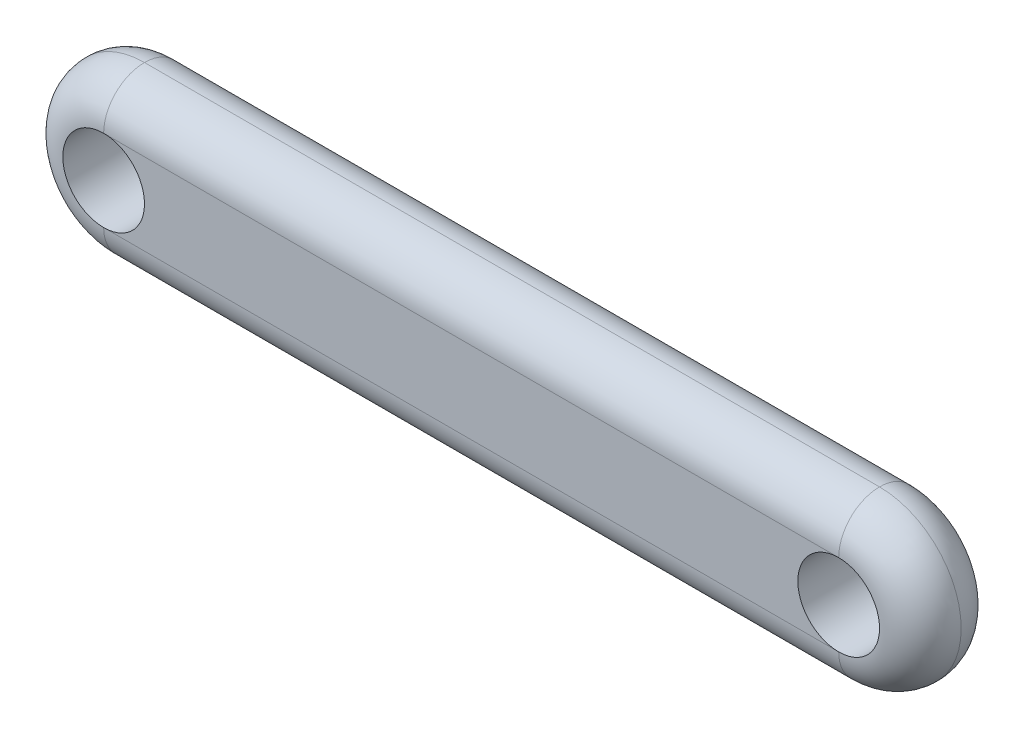
ISO-10303-21;
HEADER;
FILE_DESCRIPTION(('STEP AP214'),'2;1');
FILE_NAME('part.step','',(''),(''),'','','');
FILE_SCHEMA(('AUTOMOTIVE_DESIGN { 1 0 10303 214 1 1 1 1 }'));
ENDSEC;
DATA;
#1=APPLICATION_CONTEXT('core data for automotive mechanical design processes');
#2=APPLICATION_PROTOCOL_DEFINITION('international standard','automotive_design',2000,#1);
#3=PRODUCT_CONTEXT('',#1,'mechanical');
#4=PRODUCT('Part','Part','',(#3));
#5=PRODUCT_RELATED_PRODUCT_CATEGORY('part','',(#4));
#6=PRODUCT_DEFINITION_FORMATION('','',#4);
#7=PRODUCT_DEFINITION_CONTEXT('part definition',#1,'design');
#8=PRODUCT_DEFINITION('design','',#6,#7);
#9=PRODUCT_DEFINITION_SHAPE('','',#8);
#10=(LENGTH_UNIT() NAMED_UNIT(*) SI_UNIT(.MILLI.,.METRE.));
#11=(NAMED_UNIT(*) PLANE_ANGLE_UNIT() SI_UNIT($,.RADIAN.));
#12=(NAMED_UNIT(*) SI_UNIT($,.STERADIAN.) SOLID_ANGLE_UNIT());
#13=UNCERTAINTY_MEASURE_WITH_UNIT(LENGTH_MEASURE(1.E-05),#10,'distance_accuracy_value','');
#14=(GEOMETRIC_REPRESENTATION_CONTEXT(3) GLOBAL_UNCERTAINTY_ASSIGNED_CONTEXT((#13)) GLOBAL_UNIT_ASSIGNED_CONTEXT((#10,
#11,#12)) REPRESENTATION_CONTEXT('',''));
#15=CARTESIAN_POINT('',(0.,0.,0.));
#16=DIRECTION('',(0.,0.,1.));
#17=DIRECTION('',(1.,0.,0.));
#18=AXIS2_PLACEMENT_3D('',#15,#16,#17);
#19=CARTESIAN_POINT('',(22.5,0.,5.));
#20=DIRECTION('',(0.,0.,-1.));
#21=DIRECTION('',(-1.,0.,0.));
#22=AXIS2_PLACEMENT_3D('',#19,#20,#21);
#23=PLANE('',#22);
#24=CARTESIAN_POINT('',(-22.5,0.,5.));
#25=DIRECTION('',(0.,0.,1.));
#26=DIRECTION('',(1.,0.,0.));
#27=AXIS2_PLACEMENT_3D('',#24,#25,#26);
#28=CIRCLE('',#27,2.49999999999999);
#29=CARTESIAN_POINT('',(-22.5,-2.5,5.));
#30=VERTEX_POINT('',#29);
#31=CARTESIAN_POINT('',(-22.5,2.5,5.));
#32=VERTEX_POINT('',#31);
#33=EDGE_CURVE('E120',#30,#32,#28,.T.);
#34=ORIENTED_EDGE('',*,*,#33,.F.);
#35=DIRECTION('',(1.,0.,0.));
#36=VECTOR('',#35,1.);
#37=CARTESIAN_POINT('',(22.5,-2.50000000000001,5.));
#38=LINE('',#37,#36);
#39=CARTESIAN_POINT('',(22.5,-2.49999999999999,5.));
#40=VERTEX_POINT('',#39);
#41=EDGE_CURVE('E136',#30,#40,#38,.T.);
#42=ORIENTED_EDGE('',*,*,#41,.T.);
#43=CARTESIAN_POINT('',(22.5,0.,5.));
#44=DIRECTION('',(0.,0.,1.));
#45=DIRECTION('',(-1.,0.,0.));
#46=AXIS2_PLACEMENT_3D('',#43,#44,#45);
#47=CIRCLE('',#46,2.49999999999999);
#48=CARTESIAN_POINT('',(22.5,2.50000000000001,5.));
#49=VERTEX_POINT('',#48);
#50=EDGE_CURVE('E129',#49,#40,#47,.T.);
#51=ORIENTED_EDGE('',*,*,#50,.F.);
#52=DIRECTION('',(-1.,0.,0.));
#53=VECTOR('',#52,1.);
#54=CARTESIAN_POINT('',(22.5,2.50000000000001,5.));
#55=LINE('',#54,#53);
#56=EDGE_CURVE('E89',#49,#32,#55,.T.);
#57=ORIENTED_EDGE('',*,*,#56,.T.);
#58=EDGE_LOOP('',(#34,#42,#51,#57));
#59=FACE_BOUND('',#58,.T.);
#60=ADVANCED_FACE('F43',(#59),#23,.F.);
#61=CARTESIAN_POINT('',(22.5,0.,0.));
#62=DIRECTION('',(0.,0.,-1.));
#63=DIRECTION('',(-1.,0.,0.));
#64=AXIS2_PLACEMENT_3D('',#61,#62,#63);
#65=PLANE('',#64);
#66=CARTESIAN_POINT('',(22.5,0.,0.));
#67=DIRECTION('',(0.,0.,1.));
#68=DIRECTION('',(-1.,0.,0.));
#69=AXIS2_PLACEMENT_3D('',#66,#67,#68);
#70=CIRCLE('',#69,2.49999999999999);
#71=CARTESIAN_POINT('',(22.5,2.50000000000001,0.));
#72=VERTEX_POINT('',#71);
#73=CARTESIAN_POINT('',(22.5,-2.49999999999999,0.));
#74=VERTEX_POINT('',#73);
#75=EDGE_CURVE('E124',#72,#74,#70,.T.);
#76=ORIENTED_EDGE('',*,*,#75,.T.);
#77=DIRECTION('',(1.,0.,0.));
#78=VECTOR('',#77,1.);
#79=CARTESIAN_POINT('',(-22.5,-2.5,0.));
#80=LINE('',#79,#78);
#81=CARTESIAN_POINT('',(-22.5,-2.5,0.));
#82=VERTEX_POINT('',#81);
#83=EDGE_CURVE('E11',#74,#82,#80,.F.);
#84=ORIENTED_EDGE('',*,*,#83,.T.);
#85=CARTESIAN_POINT('',(-22.5,0.,0.));
#86=DIRECTION('',(0.,0.,1.));
#87=DIRECTION('',(1.,0.,0.));
#88=AXIS2_PLACEMENT_3D('',#85,#86,#87);
#89=CIRCLE('',#88,2.49999999999999);
#90=CARTESIAN_POINT('',(-22.5,2.5,0.));
#91=VERTEX_POINT('',#90);
#92=EDGE_CURVE('E121',#82,#91,#89,.T.);
#93=ORIENTED_EDGE('',*,*,#92,.T.);
#94=DIRECTION('',(-1.,0.,0.));
#95=VECTOR('',#94,1.);
#96=CARTESIAN_POINT('',(22.5,2.50000000000001,0.));
#97=LINE('',#96,#95);
#98=EDGE_CURVE('E53',#91,#72,#97,.F.);
#99=ORIENTED_EDGE('',*,*,#98,.T.);
#100=EDGE_LOOP('',(#76,#84,#93,#99));
#101=FACE_BOUND('',#100,.T.);
#102=ADVANCED_FACE('F123',(#101),#65,.T.);
#103=CARTESIAN_POINT('',(-22.5,0.,5.));
#104=DIRECTION('',(0.,0.,-1.));
#105=DIRECTION('',(-1.,0.,0.));
#106=AXIS2_PLACEMENT_3D('',#103,#104,#105);
#107=CYLINDRICAL_SURFACE('',#106,2.49999999999999);
#108=EDGE_CURVE('E133',#32,#30,#28,.T.);
#109=ORIENTED_EDGE('',*,*,#108,.T.);
#110=ORIENTED_EDGE('',*,*,#33,.T.);
#111=EDGE_LOOP('',(#109,#110));
#112=FACE_BOUND('',#111,.T.);
#113=EDGE_CURVE('E116',#91,#82,#89,.T.);
#114=ORIENTED_EDGE('',*,*,#113,.F.);
#115=ORIENTED_EDGE('',*,*,#92,.F.);
#116=EDGE_LOOP('',(#114,#115));
#117=FACE_BOUND('',#116,.T.);
#118=ADVANCED_FACE('F126',(#112,#117),#107,.F.);
#119=CARTESIAN_POINT('',(22.5,0.,5.));
#120=DIRECTION('',(0.,0.,-1.));
#121=DIRECTION('',(-1.,0.,0.));
#122=AXIS2_PLACEMENT_3D('',#119,#120,#121);
#123=CYLINDRICAL_SURFACE('',#122,2.49999999999999);
#124=EDGE_CURVE('E127',#40,#49,#47,.T.);
#125=ORIENTED_EDGE('',*,*,#124,.T.);
#126=ORIENTED_EDGE('',*,*,#50,.T.);
#127=EDGE_LOOP('',(#125,#126));
#128=FACE_BOUND('',#127,.T.);
#129=EDGE_CURVE('E160',#74,#72,#70,.T.);
#130=ORIENTED_EDGE('',*,*,#129,.F.);
#131=ORIENTED_EDGE('',*,*,#75,.F.);
#132=EDGE_LOOP('',(#130,#131));
#133=FACE_BOUND('',#132,.T.);
#134=ADVANCED_FACE('F166',(#128,#133),#123,.F.);
#135=CARTESIAN_POINT('',(-22.5,2.5,2.5));
#136=DIRECTION('',(1.,0.,0.));
#137=DIRECTION('',(0.,1.,0.));
#138=AXIS2_PLACEMENT_3D('',#135,#136,#137);
#139=CYLINDRICAL_SURFACE('',#138,2.5);
#140=CARTESIAN_POINT('',(22.5,2.50000000000001,2.5));
#141=DIRECTION('',(1.,0.,0.));
#142=DIRECTION('',(0.,0.,-1.));
#143=AXIS2_PLACEMENT_3D('',#140,#141,#142);
#144=CIRCLE('',#143,2.5);
#145=CARTESIAN_POINT('',(22.5,5.00000000000001,2.5));
#146=VERTEX_POINT('',#145);
#147=EDGE_CURVE('E156',#72,#146,#144,.T.);
#148=ORIENTED_EDGE('',*,*,#147,.F.);
#149=ORIENTED_EDGE('',*,*,#98,.F.);
#150=CARTESIAN_POINT('',(-22.5,2.5,2.5));
#151=DIRECTION('',(-1.,0.,0.));
#152=DIRECTION('',(0.,0.,1.));
#153=AXIS2_PLACEMENT_3D('',#150,#151,#152);
#154=CIRCLE('',#153,2.5);
#155=CARTESIAN_POINT('',(-22.5,5.,2.5));
#156=VERTEX_POINT('',#155);
#157=EDGE_CURVE('E47',#156,#91,#154,.T.);
#158=ORIENTED_EDGE('',*,*,#157,.F.);
#159=DIRECTION('',(-1.,0.,0.));
#160=VECTOR('',#159,1.);
#161=CARTESIAN_POINT('',(-22.5,5.,2.5));
#162=LINE('',#161,#160);
#163=EDGE_CURVE('E78',#146,#156,#162,.T.);
#164=ORIENTED_EDGE('',*,*,#163,.F.);
#165=EDGE_LOOP('',(#148,#149,#158,#164));
#166=FACE_BOUND('',#165,.T.);
#167=ADVANCED_FACE('F45',(#166),#139,.T.);
#168=CARTESIAN_POINT('',(-22.5,0.,2.5));
#169=DIRECTION('',(0.,0.,-1.));
#170=DIRECTION('',(-1.,0.,0.));
#171=AXIS2_PLACEMENT_3D('',#168,#169,#170);
#172=TOROIDAL_SURFACE('',#171,2.5,2.5);
#173=ORIENTED_EDGE('',*,*,#157,.T.);
#174=ORIENTED_EDGE('',*,*,#113,.T.);
#175=CARTESIAN_POINT('',(-22.5,-2.50000000000001,2.5));
#176=DIRECTION('',(1.,0.,0.));
#177=DIRECTION('',(0.,0.,-1.));
#178=AXIS2_PLACEMENT_3D('',#175,#176,#177);
#179=CIRCLE('',#178,2.5);
#180=CARTESIAN_POINT('',(-22.5,-5.,2.5));
#181=VERTEX_POINT('',#180);
#182=EDGE_CURVE('E103',#181,#82,#179,.T.);
#183=ORIENTED_EDGE('',*,*,#182,.F.);
#184=CARTESIAN_POINT('',(-22.5,0.,2.5));
#185=DIRECTION('',(0.,0.,-1.));
#186=DIRECTION('',(-1.,0.,0.));
#187=AXIS2_PLACEMENT_3D('',#184,#185,#186);
#188=CIRCLE('',#187,5.);
#189=EDGE_CURVE('E113',#156,#181,#188,.F.);
#190=ORIENTED_EDGE('',*,*,#189,.F.);
#191=EDGE_LOOP('',(#173,#174,#183,#190));
#192=FACE_BOUND('',#191,.T.);
#193=ADVANCED_FACE('F117',(#192),#172,.T.);
#194=CARTESIAN_POINT('',(22.5,2.50000000000001,2.5));
#195=DIRECTION('',(-1.,0.,0.));
#196=DIRECTION('',(0.,-1.,0.));
#197=AXIS2_PLACEMENT_3D('',#194,#195,#196);
#198=CYLINDRICAL_SURFACE('',#197,2.5);
#199=CARTESIAN_POINT('',(22.5,2.50000000000001,2.5));
#200=DIRECTION('',(1.,0.,0.));
#201=DIRECTION('',(0.,0.,-1.));
#202=AXIS2_PLACEMENT_3D('',#199,#200,#201);
#203=CIRCLE('',#202,2.5);
#204=EDGE_CURVE('E148',#146,#49,#203,.T.);
#205=ORIENTED_EDGE('',*,*,#204,.F.);
#206=ORIENTED_EDGE('',*,*,#163,.T.);
#207=CARTESIAN_POINT('',(-22.5,2.5,2.5));
#208=DIRECTION('',(-1.,0.,0.));
#209=DIRECTION('',(0.,0.,1.));
#210=AXIS2_PLACEMENT_3D('',#207,#208,#209);
#211=CIRCLE('',#210,2.5);
#212=EDGE_CURVE('E151',#32,#156,#211,.T.);
#213=ORIENTED_EDGE('',*,*,#212,.F.);
#214=ORIENTED_EDGE('',*,*,#56,.F.);
#215=EDGE_LOOP('',(#205,#206,#213,#214));
#216=FACE_BOUND('',#215,.T.);
#217=ADVANCED_FACE('F178',(#216),#198,.T.);
#218=CARTESIAN_POINT('',(22.5,0.,2.5));
#219=DIRECTION('',(0.,0.,-1.));
#220=DIRECTION('',(-1.,0.,0.));
#221=AXIS2_PLACEMENT_3D('',#218,#219,#220);
#222=TOROIDAL_SURFACE('',#221,2.50000000000001,2.5);
#223=CARTESIAN_POINT('',(22.5,-2.50000000000001,2.5));
#224=DIRECTION('',(-1.,0.,0.));
#225=DIRECTION('',(0.,0.,1.));
#226=AXIS2_PLACEMENT_3D('',#223,#224,#225);
#227=CIRCLE('',#226,2.5);
#228=CARTESIAN_POINT('',(22.5,-5.00000000000001,2.5));
#229=VERTEX_POINT('',#228);
#230=EDGE_CURVE('E112',#74,#229,#227,.T.);
#231=ORIENTED_EDGE('',*,*,#230,.F.);
#232=ORIENTED_EDGE('',*,*,#129,.T.);
#233=ORIENTED_EDGE('',*,*,#147,.T.);
#234=CARTESIAN_POINT('',(22.5,0.,2.5));
#235=DIRECTION('',(0.,0.,-1.));
#236=DIRECTION('',(-1.,0.,0.));
#237=AXIS2_PLACEMENT_3D('',#234,#235,#236);
#238=CIRCLE('',#237,5.00000000000001);
#239=EDGE_CURVE('E145',#229,#146,#238,.F.);
#240=ORIENTED_EDGE('',*,*,#239,.F.);
#241=EDGE_LOOP('',(#231,#232,#233,#240));
#242=FACE_BOUND('',#241,.T.);
#243=ADVANCED_FACE('F204',(#242),#222,.T.);
#244=CARTESIAN_POINT('',(-22.5,-2.5,2.5));
#245=DIRECTION('',(-1.,0.,0.));
#246=DIRECTION('',(0.,-1.,0.));
#247=AXIS2_PLACEMENT_3D('',#244,#245,#246);
#248=CYLINDRICAL_SURFACE('',#247,2.5);
#249=ORIENTED_EDGE('',*,*,#83,.F.);
#250=ORIENTED_EDGE('',*,*,#230,.T.);
#251=DIRECTION('',(1.,0.,0.));
#252=VECTOR('',#251,1.);
#253=CARTESIAN_POINT('',(22.5,-5.00000000000001,2.5));
#254=LINE('',#253,#252);
#255=EDGE_CURVE('E107',#181,#229,#254,.T.);
#256=ORIENTED_EDGE('',*,*,#255,.F.);
#257=ORIENTED_EDGE('',*,*,#182,.T.);
#258=EDGE_LOOP('',(#249,#250,#256,#257));
#259=FACE_BOUND('',#258,.T.);
#260=ADVANCED_FACE('F105',(#259),#248,.T.);
#261=CARTESIAN_POINT('',(-22.5,0.,2.5));
#262=DIRECTION('',(0.,0.,-1.));
#263=DIRECTION('',(-1.,0.,0.));
#264=AXIS2_PLACEMENT_3D('',#261,#262,#263);
#265=TOROIDAL_SURFACE('',#264,2.5,2.5);
#266=ORIENTED_EDGE('',*,*,#212,.T.);
#267=ORIENTED_EDGE('',*,*,#189,.T.);
#268=CARTESIAN_POINT('',(-22.5,-2.50000000000001,2.5));
#269=DIRECTION('',(1.,0.,0.));
#270=DIRECTION('',(0.,0.,-1.));
#271=AXIS2_PLACEMENT_3D('',#268,#269,#270);
#272=CIRCLE('',#271,2.5);
#273=EDGE_CURVE('E142',#30,#181,#272,.T.);
#274=ORIENTED_EDGE('',*,*,#273,.F.);
#275=ORIENTED_EDGE('',*,*,#108,.F.);
#276=EDGE_LOOP('',(#266,#267,#274,#275));
#277=FACE_BOUND('',#276,.T.);
#278=ADVANCED_FACE('F181',(#277),#265,.T.);
#279=CARTESIAN_POINT('',(22.5,0.,2.5));
#280=DIRECTION('',(0.,0.,-1.));
#281=DIRECTION('',(-1.,0.,0.));
#282=AXIS2_PLACEMENT_3D('',#279,#280,#281);
#283=TOROIDAL_SURFACE('',#282,2.50000000000001,2.5);
#284=ORIENTED_EDGE('',*,*,#204,.T.);
#285=ORIENTED_EDGE('',*,*,#124,.F.);
#286=CARTESIAN_POINT('',(22.5,-2.50000000000001,2.5));
#287=DIRECTION('',(-1.,0.,0.));
#288=DIRECTION('',(0.,0.,1.));
#289=AXIS2_PLACEMENT_3D('',#286,#287,#288);
#290=CIRCLE('',#289,2.5);
#291=EDGE_CURVE('E140',#229,#40,#290,.T.);
#292=ORIENTED_EDGE('',*,*,#291,.F.);
#293=ORIENTED_EDGE('',*,*,#239,.T.);
#294=EDGE_LOOP('',(#284,#285,#292,#293));
#295=FACE_BOUND('',#294,.T.);
#296=ADVANCED_FACE('F176',(#295),#283,.T.);
#297=CARTESIAN_POINT('',(22.5,-2.50000000000001,2.5));
#298=DIRECTION('',(1.,0.,0.));
#299=DIRECTION('',(0.,1.,0.));
#300=AXIS2_PLACEMENT_3D('',#297,#298,#299);
#301=CYLINDRICAL_SURFACE('',#300,2.5);
#302=ORIENTED_EDGE('',*,*,#273,.T.);
#303=ORIENTED_EDGE('',*,*,#255,.T.);
#304=ORIENTED_EDGE('',*,*,#291,.T.);
#305=ORIENTED_EDGE('',*,*,#41,.F.);
#306=EDGE_LOOP('',(#302,#303,#304,#305));
#307=FACE_BOUND('',#306,.T.);
#308=ADVANCED_FACE('F172',(#307),#301,.T.);
#309=CLOSED_SHELL('',(#60,#102,#118,#134,#167,#193,#217,#243,#260,#278,#296,#308));
#310=MANIFOLD_SOLID_BREP('B2',#309);
#311=ADVANCED_BREP_SHAPE_REPRESENTATION('',(#18,#310),#14);
#312=SHAPE_DEFINITION_REPRESENTATION(#9,#311);
ENDSEC;
END-ISO-10303-21;
